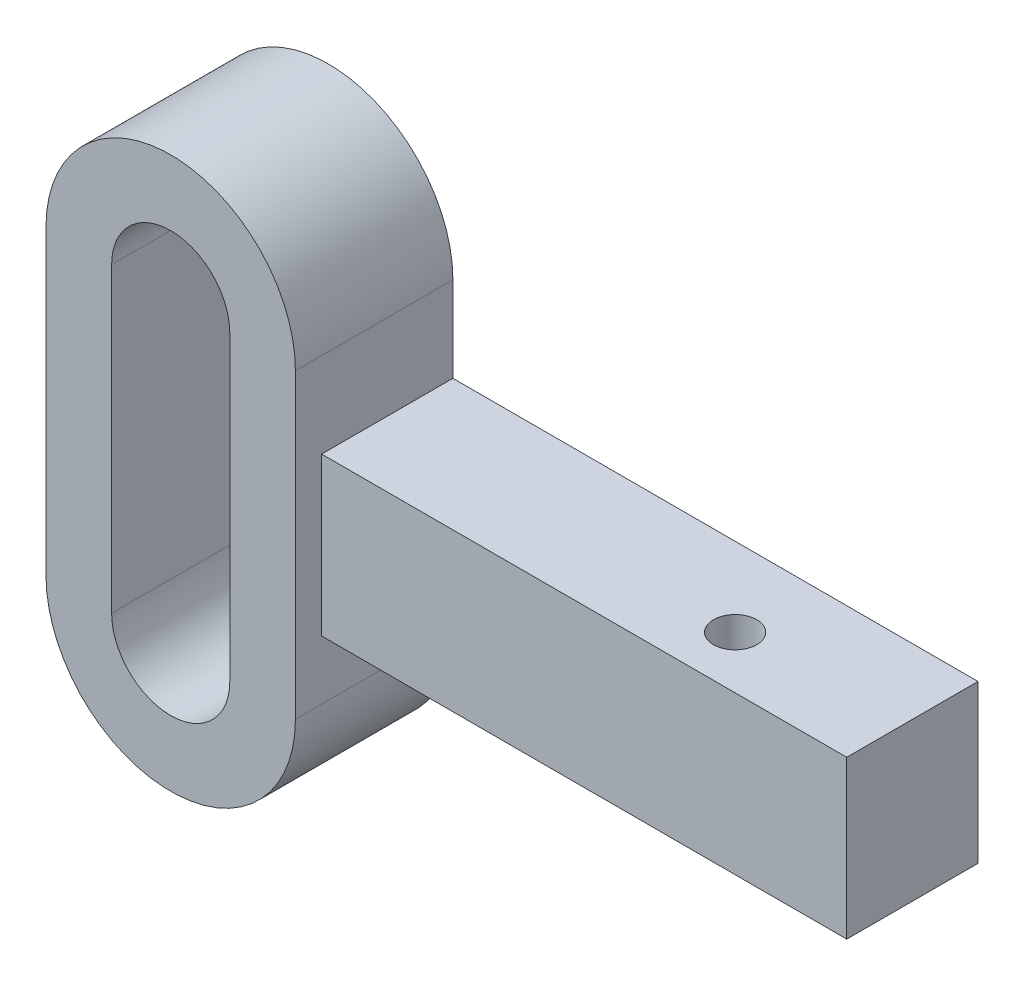
ISO-10303-21;
HEADER;
FILE_DESCRIPTION(('STEP AP214'),'2;1');
FILE_NAME('part.step','',(''),(''),'','','');
FILE_SCHEMA(('AUTOMOTIVE_DESIGN { 1 0 10303 214 1 1 1 1 }'));
ENDSEC;
DATA;
#1=APPLICATION_CONTEXT('core data for automotive mechanical design processes');
#2=APPLICATION_PROTOCOL_DEFINITION('international standard','automotive_design',2000,#1);
#3=PRODUCT_CONTEXT('',#1,'mechanical');
#4=PRODUCT('Part','Part','',(#3));
#5=PRODUCT_RELATED_PRODUCT_CATEGORY('part','',(#4));
#6=PRODUCT_DEFINITION_FORMATION('','',#4);
#7=PRODUCT_DEFINITION_CONTEXT('part definition',#1,'design');
#8=PRODUCT_DEFINITION('design','',#6,#7);
#9=PRODUCT_DEFINITION_SHAPE('','',#8);
#10=(LENGTH_UNIT() NAMED_UNIT(*) SI_UNIT(.MILLI.,.METRE.));
#11=(NAMED_UNIT(*) PLANE_ANGLE_UNIT() SI_UNIT($,.RADIAN.));
#12=(NAMED_UNIT(*) SI_UNIT($,.STERADIAN.) SOLID_ANGLE_UNIT());
#13=UNCERTAINTY_MEASURE_WITH_UNIT(LENGTH_MEASURE(1.E-05),#10,'distance_accuracy_value','');
#14=(GEOMETRIC_REPRESENTATION_CONTEXT(3) GLOBAL_UNCERTAINTY_ASSIGNED_CONTEXT((#13)) GLOBAL_UNIT_ASSIGNED_CONTEXT((#10,
#11,#12)) REPRESENTATION_CONTEXT('',''));
#15=CARTESIAN_POINT('',(0.,0.,0.));
#16=DIRECTION('',(0.,0.,1.));
#17=DIRECTION('',(1.,0.,0.));
#18=AXIS2_PLACEMENT_3D('',#15,#16,#17);
#19=CARTESIAN_POINT('',(9.5,11.5,12.));
#20=DIRECTION('',(-1.,0.,0.));
#21=DIRECTION('',(0.,-1.,0.));
#22=AXIS2_PLACEMENT_3D('',#19,#20,#21);
#23=PLANE('',#22);
#24=DIRECTION('',(0.,0.,-1.));
#25=VECTOR('',#24,1.);
#26=CARTESIAN_POINT('',(9.5,-7.,10.));
#27=LINE('',#26,#25);
#28=CARTESIAN_POINT('',(9.5,-7.,10.));
#29=VERTEX_POINT('',#28);
#30=CARTESIAN_POINT('',(9.5,-7.,0.));
#31=VERTEX_POINT('',#30);
#32=EDGE_CURVE('E71',#29,#31,#27,.T.);
#33=ORIENTED_EDGE('',*,*,#32,.F.);
#34=DIRECTION('',(0.,-1.,0.));
#35=VECTOR('',#34,1.);
#36=CARTESIAN_POINT('',(9.5,5.,10.));
#37=LINE('',#36,#35);
#38=CARTESIAN_POINT('',(9.5,5.,10.));
#39=VERTEX_POINT('',#38);
#40=EDGE_CURVE('E66',#39,#29,#37,.T.);
#41=ORIENTED_EDGE('',*,*,#40,.F.);
#42=DIRECTION('',(0.,0.,-1.));
#43=VECTOR('',#42,1.);
#44=CARTESIAN_POINT('',(9.5,5.,10.));
#45=LINE('',#44,#43);
#46=CARTESIAN_POINT('',(9.5,5.,0.));
#47=VERTEX_POINT('',#46);
#48=EDGE_CURVE('E166',#39,#47,#45,.T.);
#49=ORIENTED_EDGE('',*,*,#48,.T.);
#50=DIRECTION('',(0.,1.,0.));
#51=VECTOR('',#50,1.);
#52=CARTESIAN_POINT('',(9.5,11.5,0.));
#53=LINE('',#52,#51);
#54=CARTESIAN_POINT('',(9.5,11.5,0.));
#55=VERTEX_POINT('',#54);
#56=EDGE_CURVE('E254',#47,#55,#53,.T.);
#57=ORIENTED_EDGE('',*,*,#56,.T.);
#58=DIRECTION('',(0.,0.,-1.));
#59=VECTOR('',#58,1.);
#60=CARTESIAN_POINT('',(9.5,11.5,12.));
#61=LINE('',#60,#59);
#62=CARTESIAN_POINT('',(9.5,11.5,12.));
#63=VERTEX_POINT('',#62);
#64=EDGE_CURVE('E244',#63,#55,#61,.T.);
#65=ORIENTED_EDGE('',*,*,#64,.F.);
#66=DIRECTION('',(0.,1.,0.));
#67=VECTOR('',#66,1.);
#68=CARTESIAN_POINT('',(9.5,11.5,12.));
#69=LINE('',#68,#67);
#70=CARTESIAN_POINT('',(9.5,-11.5,12.));
#71=VERTEX_POINT('',#70);
#72=EDGE_CURVE('E241',#71,#63,#69,.T.);
#73=ORIENTED_EDGE('',*,*,#72,.F.);
#74=DIRECTION('',(0.,0.,-1.));
#75=VECTOR('',#74,1.);
#76=CARTESIAN_POINT('',(9.5,-11.5,12.));
#77=LINE('',#76,#75);
#78=CARTESIAN_POINT('',(9.5,-11.5,0.));
#79=VERTEX_POINT('',#78);
#80=EDGE_CURVE('E260',#71,#79,#77,.T.);
#81=ORIENTED_EDGE('',*,*,#80,.T.);
#82=EDGE_CURVE('E235',#79,#31,#53,.T.);
#83=ORIENTED_EDGE('',*,*,#82,.T.);
#84=EDGE_LOOP('',(#33,#41,#49,#57,#65,#73,#81,#83));
#85=FACE_BOUND('',#84,.T.);
#86=ADVANCED_FACE('F50',(#85),#23,.F.);
#87=CARTESIAN_POINT('',(0.,11.5,12.));
#88=DIRECTION('',(0.,0.,1.));
#89=DIRECTION('',(1.,0.,0.));
#90=AXIS2_PLACEMENT_3D('',#87,#88,#89);
#91=PLANE('',#90);
#92=CARTESIAN_POINT('',(0.,11.5,12.));
#93=DIRECTION('',(0.,0.,1.));
#94=DIRECTION('',(1.,0.,0.));
#95=AXIS2_PLACEMENT_3D('',#92,#93,#94);
#96=CIRCLE('',#95,9.5);
#97=CARTESIAN_POINT('',(-9.5,11.5,12.));
#98=VERTEX_POINT('',#97);
#99=EDGE_CURVE('E230',#63,#98,#96,.T.);
#100=ORIENTED_EDGE('',*,*,#99,.T.);
#101=DIRECTION('',(0.,-1.,0.));
#102=VECTOR('',#101,1.);
#103=CARTESIAN_POINT('',(-9.5,11.5,12.));
#104=LINE('',#103,#102);
#105=CARTESIAN_POINT('',(-9.49999999999999,-11.5,12.));
#106=VERTEX_POINT('',#105);
#107=EDGE_CURVE('E234',#98,#106,#104,.T.);
#108=ORIENTED_EDGE('',*,*,#107,.T.);
#109=CARTESIAN_POINT('',(0.,-11.5,12.));
#110=DIRECTION('',(0.,0.,1.));
#111=DIRECTION('',(1.,0.,0.));
#112=AXIS2_PLACEMENT_3D('',#109,#110,#111);
#113=CIRCLE('',#112,9.5);
#114=EDGE_CURVE('E238',#106,#71,#113,.T.);
#115=ORIENTED_EDGE('',*,*,#114,.T.);
#116=ORIENTED_EDGE('',*,*,#72,.T.);
#117=EDGE_LOOP('',(#100,#108,#115,#116));
#118=FACE_BOUND('',#117,.T.);
#119=DIRECTION('',(0.,-1.,0.));
#120=VECTOR('',#119,1.);
#121=CARTESIAN_POINT('',(-4.5,11.5,12.));
#122=LINE('',#121,#120);
#123=CARTESIAN_POINT('',(-4.5,11.5,12.));
#124=VERTEX_POINT('',#123);
#125=CARTESIAN_POINT('',(-4.5,-11.5,12.));
#126=VERTEX_POINT('',#125);
#127=EDGE_CURVE('E190',#124,#126,#122,.T.);
#128=ORIENTED_EDGE('',*,*,#127,.F.);
#129=CARTESIAN_POINT('',(0.,11.5,12.));
#130=DIRECTION('',(0.,0.,1.));
#131=DIRECTION('',(1.,0.,0.));
#132=AXIS2_PLACEMENT_3D('',#129,#130,#131);
#133=CIRCLE('',#132,4.5);
#134=CARTESIAN_POINT('',(4.5,11.5,12.));
#135=VERTEX_POINT('',#134);
#136=EDGE_CURVE('E187',#135,#124,#133,.T.);
#137=ORIENTED_EDGE('',*,*,#136,.F.);
#138=DIRECTION('',(0.,1.,0.));
#139=VECTOR('',#138,1.);
#140=CARTESIAN_POINT('',(4.5,11.5,12.));
#141=LINE('',#140,#139);
#142=CARTESIAN_POINT('',(4.5,-11.5,12.));
#143=VERTEX_POINT('',#142);
#144=EDGE_CURVE('E198',#143,#135,#141,.T.);
#145=ORIENTED_EDGE('',*,*,#144,.F.);
#146=CARTESIAN_POINT('',(0.,-11.5,12.));
#147=DIRECTION('',(0.,0.,1.));
#148=DIRECTION('',(1.,0.,0.));
#149=AXIS2_PLACEMENT_3D('',#146,#147,#148);
#150=CIRCLE('',#149,4.5);
#151=EDGE_CURVE('E194',#126,#143,#150,.T.);
#152=ORIENTED_EDGE('',*,*,#151,.F.);
#153=EDGE_LOOP('',(#128,#137,#145,#152));
#154=FACE_BOUND('',#153,.T.);
#155=ADVANCED_FACE('F283',(#118,#154),#91,.T.);
#156=CARTESIAN_POINT('',(0.,11.5,0.));
#157=DIRECTION('',(0.,0.,1.));
#158=DIRECTION('',(1.,0.,0.));
#159=AXIS2_PLACEMENT_3D('',#156,#157,#158);
#160=PLANE('',#159);
#161=CARTESIAN_POINT('',(0.,11.5,0.));
#162=DIRECTION('',(0.,0.,1.));
#163=DIRECTION('',(1.,0.,0.));
#164=AXIS2_PLACEMENT_3D('',#161,#162,#163);
#165=CIRCLE('',#164,9.5);
#166=CARTESIAN_POINT('',(-9.5,11.5,0.));
#167=VERTEX_POINT('',#166);
#168=EDGE_CURVE('E229',#55,#167,#165,.T.);
#169=ORIENTED_EDGE('',*,*,#168,.F.);
#170=ORIENTED_EDGE('',*,*,#56,.F.);
#171=DIRECTION('',(-1.,0.,0.));
#172=VECTOR('',#171,1.);
#173=CARTESIAN_POINT('',(9.5,5.,0.));
#174=LINE('',#173,#172);
#175=CARTESIAN_POINT('',(49.5,5.,0.));
#176=VERTEX_POINT('',#175);
#177=EDGE_CURVE('E176',#176,#47,#174,.T.);
#178=ORIENTED_EDGE('',*,*,#177,.F.);
#179=DIRECTION('',(0.,1.,0.));
#180=VECTOR('',#179,1.);
#181=CARTESIAN_POINT('',(49.5,5.,0.));
#182=LINE('',#181,#180);
#183=CARTESIAN_POINT('',(49.5,-7.,0.));
#184=VERTEX_POINT('',#183);
#185=EDGE_CURVE('E172',#184,#176,#182,.T.);
#186=ORIENTED_EDGE('',*,*,#185,.F.);
#187=DIRECTION('',(1.,0.,0.));
#188=VECTOR('',#187,1.);
#189=CARTESIAN_POINT('',(9.5,-7.,0.));
#190=LINE('',#189,#188);
#191=EDGE_CURVE('E151',#31,#184,#190,.T.);
#192=ORIENTED_EDGE('',*,*,#191,.F.);
#193=ORIENTED_EDGE('',*,*,#82,.F.);
#194=CARTESIAN_POINT('',(0.,-11.5,0.));
#195=DIRECTION('',(0.,0.,1.));
#196=DIRECTION('',(1.,0.,0.));
#197=AXIS2_PLACEMENT_3D('',#194,#195,#196);
#198=CIRCLE('',#197,9.5);
#199=CARTESIAN_POINT('',(-9.49999999999999,-11.5,0.));
#200=VERTEX_POINT('',#199);
#201=EDGE_CURVE('E251',#200,#79,#198,.T.);
#202=ORIENTED_EDGE('',*,*,#201,.F.);
#203=DIRECTION('',(0.,-1.,0.));
#204=VECTOR('',#203,1.);
#205=CARTESIAN_POINT('',(-9.5,11.5,0.));
#206=LINE('',#205,#204);
#207=EDGE_CURVE('E248',#167,#200,#206,.T.);
#208=ORIENTED_EDGE('',*,*,#207,.F.);
#209=EDGE_LOOP('',(#169,#170,#178,#186,#192,#193,#202,#208));
#210=FACE_BOUND('',#209,.T.);
#211=CARTESIAN_POINT('',(0.,11.5,0.));
#212=DIRECTION('',(0.,0.,1.));
#213=DIRECTION('',(1.,0.,0.));
#214=AXIS2_PLACEMENT_3D('',#211,#212,#213);
#215=CIRCLE('',#214,4.5);
#216=CARTESIAN_POINT('',(4.5,11.5,0.));
#217=VERTEX_POINT('',#216);
#218=CARTESIAN_POINT('',(-4.5,11.5,0.));
#219=VERTEX_POINT('',#218);
#220=EDGE_CURVE('E186',#217,#219,#215,.T.);
#221=ORIENTED_EDGE('',*,*,#220,.T.);
#222=DIRECTION('',(0.,-1.,0.));
#223=VECTOR('',#222,1.);
#224=CARTESIAN_POINT('',(-4.5,11.5,0.));
#225=LINE('',#224,#223);
#226=CARTESIAN_POINT('',(-4.5,-11.5,0.));
#227=VERTEX_POINT('',#226);
#228=EDGE_CURVE('E205',#219,#227,#225,.T.);
#229=ORIENTED_EDGE('',*,*,#228,.T.);
#230=CARTESIAN_POINT('',(0.,-11.5,0.));
#231=DIRECTION('',(0.,0.,1.));
#232=DIRECTION('',(1.,0.,0.));
#233=AXIS2_PLACEMENT_3D('',#230,#231,#232);
#234=CIRCLE('',#233,4.5);
#235=CARTESIAN_POINT('',(4.5,-11.5,0.));
#236=VERTEX_POINT('',#235);
#237=EDGE_CURVE('E209',#227,#236,#234,.T.);
#238=ORIENTED_EDGE('',*,*,#237,.T.);
#239=DIRECTION('',(0.,1.,0.));
#240=VECTOR('',#239,1.);
#241=CARTESIAN_POINT('',(4.5,11.5,0.));
#242=LINE('',#241,#240);
#243=EDGE_CURVE('E191',#236,#217,#242,.T.);
#244=ORIENTED_EDGE('',*,*,#243,.T.);
#245=EDGE_LOOP('',(#221,#229,#238,#244));
#246=FACE_BOUND('',#245,.T.);
#247=ADVANCED_FACE('F277',(#210,#246),#160,.F.);
#248=CARTESIAN_POINT('',(0.,11.5,12.));
#249=DIRECTION('',(0.,0.,-1.));
#250=DIRECTION('',(-1.,0.,0.));
#251=AXIS2_PLACEMENT_3D('',#248,#249,#250);
#252=CYLINDRICAL_SURFACE('',#251,9.5);
#253=ORIENTED_EDGE('',*,*,#168,.T.);
#254=DIRECTION('',(0.,0.,-1.));
#255=VECTOR('',#254,1.);
#256=CARTESIAN_POINT('',(-9.5,11.5,12.));
#257=LINE('',#256,#255);
#258=EDGE_CURVE('E11',#98,#167,#257,.T.);
#259=ORIENTED_EDGE('',*,*,#258,.F.);
#260=ORIENTED_EDGE('',*,*,#99,.F.);
#261=ORIENTED_EDGE('',*,*,#64,.T.);
#262=EDGE_LOOP('',(#253,#259,#260,#261));
#263=FACE_BOUND('',#262,.T.);
#264=ADVANCED_FACE('F52',(#263),#252,.T.);
#265=CARTESIAN_POINT('',(-9.5,11.5,12.));
#266=DIRECTION('',(1.,0.,0.));
#267=DIRECTION('',(0.,1.,0.));
#268=AXIS2_PLACEMENT_3D('',#265,#266,#267);
#269=PLANE('',#268);
#270=ORIENTED_EDGE('',*,*,#207,.T.);
#271=DIRECTION('',(0.,0.,-1.));
#272=VECTOR('',#271,1.);
#273=CARTESIAN_POINT('',(-9.49999999999999,-11.5,12.));
#274=LINE('',#273,#272);
#275=EDGE_CURVE('E59',#106,#200,#274,.T.);
#276=ORIENTED_EDGE('',*,*,#275,.F.);
#277=ORIENTED_EDGE('',*,*,#107,.F.);
#278=ORIENTED_EDGE('',*,*,#258,.T.);
#279=EDGE_LOOP('',(#270,#276,#277,#278));
#280=FACE_BOUND('',#279,.T.);
#281=ADVANCED_FACE('F286',(#280),#269,.F.);
#282=CARTESIAN_POINT('',(0.,-11.5,12.));
#283=DIRECTION('',(0.,0.,-1.));
#284=DIRECTION('',(-1.,0.,0.));
#285=AXIS2_PLACEMENT_3D('',#282,#283,#284);
#286=CYLINDRICAL_SURFACE('',#285,9.5);
#287=ORIENTED_EDGE('',*,*,#201,.T.);
#288=ORIENTED_EDGE('',*,*,#80,.F.);
#289=ORIENTED_EDGE('',*,*,#114,.F.);
#290=ORIENTED_EDGE('',*,*,#275,.T.);
#291=EDGE_LOOP('',(#287,#288,#289,#290));
#292=FACE_BOUND('',#291,.T.);
#293=ADVANCED_FACE('F271',(#292),#286,.T.);
#294=CARTESIAN_POINT('',(0.,11.5,12.));
#295=DIRECTION('',(0.,0.,-1.));
#296=DIRECTION('',(-1.,0.,0.));
#297=AXIS2_PLACEMENT_3D('',#294,#295,#296);
#298=CYLINDRICAL_SURFACE('',#297,4.5);
#299=ORIENTED_EDGE('',*,*,#220,.F.);
#300=DIRECTION('',(0.,0.,-1.));
#301=VECTOR('',#300,1.);
#302=CARTESIAN_POINT('',(4.5,11.5,12.));
#303=LINE('',#302,#301);
#304=EDGE_CURVE('E201',#135,#217,#303,.T.);
#305=ORIENTED_EDGE('',*,*,#304,.F.);
#306=ORIENTED_EDGE('',*,*,#136,.T.);
#307=DIRECTION('',(0.,0.,-1.));
#308=VECTOR('',#307,1.);
#309=CARTESIAN_POINT('',(-4.5,11.5,12.));
#310=LINE('',#309,#308);
#311=EDGE_CURVE('E225',#124,#219,#310,.T.);
#312=ORIENTED_EDGE('',*,*,#311,.T.);
#313=EDGE_LOOP('',(#299,#305,#306,#312));
#314=FACE_BOUND('',#313,.T.);
#315=ADVANCED_FACE('F317',(#314),#298,.F.);
#316=CARTESIAN_POINT('',(-4.5,11.5,12.));
#317=DIRECTION('',(1.,0.,0.));
#318=DIRECTION('',(0.,1.,0.));
#319=AXIS2_PLACEMENT_3D('',#316,#317,#318);
#320=PLANE('',#319);
#321=ORIENTED_EDGE('',*,*,#228,.F.);
#322=ORIENTED_EDGE('',*,*,#311,.F.);
#323=ORIENTED_EDGE('',*,*,#127,.T.);
#324=DIRECTION('',(0.,0.,-1.));
#325=VECTOR('',#324,1.);
#326=CARTESIAN_POINT('',(-4.5,-11.5,12.));
#327=LINE('',#326,#325);
#328=EDGE_CURVE('E222',#126,#227,#327,.T.);
#329=ORIENTED_EDGE('',*,*,#328,.T.);
#330=EDGE_LOOP('',(#321,#322,#323,#329));
#331=FACE_BOUND('',#330,.T.);
#332=ADVANCED_FACE('F385',(#331),#320,.T.);
#333=CARTESIAN_POINT('',(0.,-11.5,12.));
#334=DIRECTION('',(0.,0.,-1.));
#335=DIRECTION('',(-1.,0.,0.));
#336=AXIS2_PLACEMENT_3D('',#333,#334,#335);
#337=CYLINDRICAL_SURFACE('',#336,4.5);
#338=ORIENTED_EDGE('',*,*,#237,.F.);
#339=ORIENTED_EDGE('',*,*,#328,.F.);
#340=ORIENTED_EDGE('',*,*,#151,.T.);
#341=DIRECTION('',(0.,0.,-1.));
#342=VECTOR('',#341,1.);
#343=CARTESIAN_POINT('',(4.5,-11.5,12.));
#344=LINE('',#343,#342);
#345=EDGE_CURVE('E219',#143,#236,#344,.T.);
#346=ORIENTED_EDGE('',*,*,#345,.T.);
#347=EDGE_LOOP('',(#338,#339,#340,#346));
#348=FACE_BOUND('',#347,.T.);
#349=ADVANCED_FACE('F376',(#348),#337,.F.);
#350=CARTESIAN_POINT('',(4.5,11.5,12.));
#351=DIRECTION('',(-1.,0.,0.));
#352=DIRECTION('',(0.,-1.,0.));
#353=AXIS2_PLACEMENT_3D('',#350,#351,#352);
#354=PLANE('',#353);
#355=ORIENTED_EDGE('',*,*,#243,.F.);
#356=ORIENTED_EDGE('',*,*,#345,.F.);
#357=ORIENTED_EDGE('',*,*,#144,.T.);
#358=ORIENTED_EDGE('',*,*,#304,.T.);
#359=EDGE_LOOP('',(#355,#356,#357,#358));
#360=FACE_BOUND('',#359,.T.);
#361=ADVANCED_FACE('F344',(#360),#354,.T.);
#362=CARTESIAN_POINT('',(9.5,-7.,10.));
#363=DIRECTION('',(0.,1.,0.));
#364=DIRECTION('',(-1.,0.,0.));
#365=AXIS2_PLACEMENT_3D('',#362,#363,#364);
#366=PLANE('',#365);
#367=CARTESIAN_POINT('',(37.,-7.,6.));
#368=DIRECTION('',(0.,-1.,0.));
#369=DIRECTION('',(0.,0.,-1.));
#370=AXIS2_PLACEMENT_3D('',#367,#368,#369);
#371=CIRCLE('',#370,1.64999999999998);
#372=CARTESIAN_POINT('',(37.,-7.,4.35000000000002));
#373=VERTEX_POINT('',#372);
#374=EDGE_CURVE('E445',#373,#373,#371,.T.);
#375=ORIENTED_EDGE('',*,*,#374,.F.);
#376=EDGE_LOOP('',(#375));
#377=FACE_BOUND('',#376,.T.);
#378=ORIENTED_EDGE('',*,*,#191,.T.);
#379=DIRECTION('',(0.,0.,-1.));
#380=VECTOR('',#379,1.);
#381=CARTESIAN_POINT('',(49.5,-7.,10.));
#382=LINE('',#381,#380);
#383=CARTESIAN_POINT('',(49.5,-7.,10.));
#384=VERTEX_POINT('',#383);
#385=EDGE_CURVE('E148',#384,#184,#382,.T.);
#386=ORIENTED_EDGE('',*,*,#385,.F.);
#387=DIRECTION('',(1.,0.,0.));
#388=VECTOR('',#387,1.);
#389=CARTESIAN_POINT('',(9.5,-7.,10.));
#390=LINE('',#389,#388);
#391=EDGE_CURVE('E138',#29,#384,#390,.T.);
#392=ORIENTED_EDGE('',*,*,#391,.F.);
#393=ORIENTED_EDGE('',*,*,#32,.T.);
#394=EDGE_LOOP('',(#378,#386,#392,#393));
#395=FACE_BOUND('',#394,.T.);
#396=ADVANCED_FACE('F149',(#377,#395),#366,.F.);
#397=CARTESIAN_POINT('',(49.5,5.,10.));
#398=DIRECTION('',(-1.,0.,0.));
#399=DIRECTION('',(0.,0.,1.));
#400=AXIS2_PLACEMENT_3D('',#397,#398,#399);
#401=PLANE('',#400);
#402=ORIENTED_EDGE('',*,*,#185,.T.);
#403=DIRECTION('',(0.,0.,-1.));
#404=VECTOR('',#403,1.);
#405=CARTESIAN_POINT('',(49.5,5.,10.));
#406=LINE('',#405,#404);
#407=CARTESIAN_POINT('',(49.5,5.,10.));
#408=VERTEX_POINT('',#407);
#409=EDGE_CURVE('E155',#408,#176,#406,.T.);
#410=ORIENTED_EDGE('',*,*,#409,.F.);
#411=DIRECTION('',(0.,1.,0.));
#412=VECTOR('',#411,1.);
#413=CARTESIAN_POINT('',(49.5,5.,10.));
#414=LINE('',#413,#412);
#415=EDGE_CURVE('E142',#384,#408,#414,.T.);
#416=ORIENTED_EDGE('',*,*,#415,.F.);
#417=ORIENTED_EDGE('',*,*,#385,.T.);
#418=EDGE_LOOP('',(#402,#410,#416,#417));
#419=FACE_BOUND('',#418,.T.);
#420=ADVANCED_FACE('F157',(#419),#401,.F.);
#421=CARTESIAN_POINT('',(9.5,5.,10.));
#422=DIRECTION('',(0.,-1.,0.));
#423=DIRECTION('',(1.,0.,0.));
#424=AXIS2_PLACEMENT_3D('',#421,#422,#423);
#425=PLANE('',#424);
#426=CARTESIAN_POINT('',(37.,5.,6.));
#427=DIRECTION('',(0.,-1.,0.));
#428=DIRECTION('',(1.,0.,0.));
#429=AXIS2_PLACEMENT_3D('',#426,#427,#428);
#430=CIRCLE('',#429,1.64999999999999);
#431=CARTESIAN_POINT('',(38.65,5.,6.));
#432=VERTEX_POINT('',#431);
#433=EDGE_CURVE('E173',#432,#432,#430,.T.);
#434=ORIENTED_EDGE('',*,*,#433,.T.);
#435=EDGE_LOOP('',(#434));
#436=FACE_BOUND('',#435,.T.);
#437=ORIENTED_EDGE('',*,*,#177,.T.);
#438=ORIENTED_EDGE('',*,*,#48,.F.);
#439=DIRECTION('',(-1.,0.,0.));
#440=VECTOR('',#439,1.);
#441=CARTESIAN_POINT('',(9.5,5.,10.));
#442=LINE('',#441,#440);
#443=EDGE_CURVE('E161',#408,#39,#442,.T.);
#444=ORIENTED_EDGE('',*,*,#443,.F.);
#445=ORIENTED_EDGE('',*,*,#409,.T.);
#446=EDGE_LOOP('',(#437,#438,#444,#445));
#447=FACE_BOUND('',#446,.T.);
#448=ADVANCED_FACE('F292',(#436,#447),#425,.F.);
#449=CARTESIAN_POINT('',(0.,0.,10.));
#450=DIRECTION('',(0.,0.,1.));
#451=DIRECTION('',(1.,0.,0.));
#452=AXIS2_PLACEMENT_3D('',#449,#450,#451);
#453=PLANE('',#452);
#454=ORIENTED_EDGE('',*,*,#40,.T.);
#455=ORIENTED_EDGE('',*,*,#391,.T.);
#456=ORIENTED_EDGE('',*,*,#415,.T.);
#457=ORIENTED_EDGE('',*,*,#443,.T.);
#458=EDGE_LOOP('',(#454,#455,#456,#457));
#459=FACE_BOUND('',#458,.T.);
#460=ADVANCED_FACE('F140',(#459),#453,.T.);
#461=CARTESIAN_POINT('',(37.,-7.,6.));
#462=DIRECTION('',(0.,-1.,0.));
#463=DIRECTION('',(0.,0.,-1.));
#464=AXIS2_PLACEMENT_3D('',#461,#462,#463);
#465=CYLINDRICAL_SURFACE('',#464,1.64999999999999);
#466=ORIENTED_EDGE('',*,*,#374,.T.);
#467=EDGE_LOOP('',(#466));
#468=FACE_BOUND('',#467,.T.);
#469=ORIENTED_EDGE('',*,*,#433,.F.);
#470=EDGE_LOOP('',(#469));
#471=FACE_BOUND('',#470,.T.);
#472=ADVANCED_FACE('F301',(#468,#471),#465,.F.);
#473=CLOSED_SHELL('',(#86,#155,#247,#264,#281,#293,#315,#332,#349,#361,#396,#420,#448,#460,#472));
#474=MANIFOLD_SOLID_BREP('B2',#473);
#475=ADVANCED_BREP_SHAPE_REPRESENTATION('',(#18,#474),#14);
#476=SHAPE_DEFINITION_REPRESENTATION(#9,#475);
ENDSEC;
END-ISO-10303-21;
